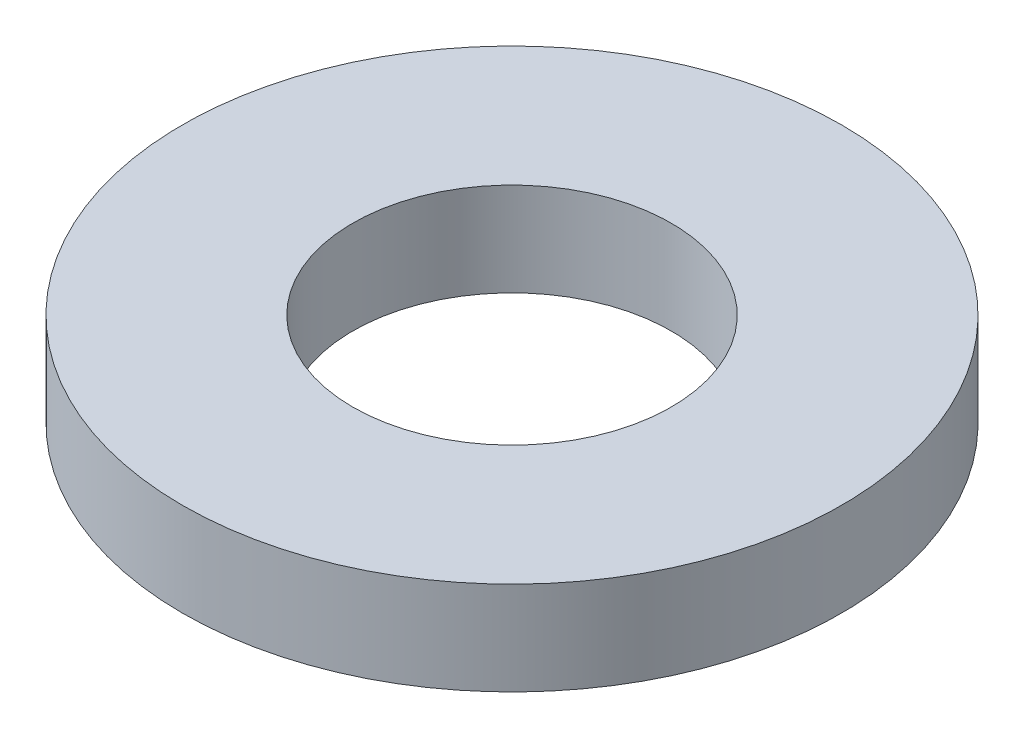
ISO-10303-21;
HEADER;
FILE_DESCRIPTION(('STEP AP214'),'2;1');
FILE_NAME('part.step','',(''),(''),'','','');
FILE_SCHEMA(('AUTOMOTIVE_DESIGN { 1 0 10303 214 1 1 1 1 }'));
ENDSEC;
DATA;
#1=APPLICATION_CONTEXT('core data for automotive mechanical design processes');
#2=APPLICATION_PROTOCOL_DEFINITION('international standard','automotive_design',2000,#1);
#3=PRODUCT_CONTEXT('',#1,'mechanical');
#4=PRODUCT('Part','Part','',(#3));
#5=PRODUCT_RELATED_PRODUCT_CATEGORY('part','',(#4));
#6=PRODUCT_DEFINITION_FORMATION('','',#4);
#7=PRODUCT_DEFINITION_CONTEXT('part definition',#1,'design');
#8=PRODUCT_DEFINITION('design','',#6,#7);
#9=PRODUCT_DEFINITION_SHAPE('','',#8);
#10=(LENGTH_UNIT() NAMED_UNIT(*) SI_UNIT(.MILLI.,.METRE.));
#11=(NAMED_UNIT(*) PLANE_ANGLE_UNIT() SI_UNIT($,.RADIAN.));
#12=(NAMED_UNIT(*) SI_UNIT($,.STERADIAN.) SOLID_ANGLE_UNIT());
#13=UNCERTAINTY_MEASURE_WITH_UNIT(LENGTH_MEASURE(1.E-05),#10,'distance_accuracy_value','');
#14=(GEOMETRIC_REPRESENTATION_CONTEXT(3) GLOBAL_UNCERTAINTY_ASSIGNED_CONTEXT((#13)) GLOBAL_UNIT_ASSIGNED_CONTEXT((#10,
#11,#12)) REPRESENTATION_CONTEXT('',''));
#15=CARTESIAN_POINT('',(0.,0.,0.));
#16=DIRECTION('',(0.,0.,1.));
#17=DIRECTION('',(1.,0.,0.));
#18=AXIS2_PLACEMENT_3D('',#15,#16,#17);
#19=CARTESIAN_POINT('',(0.,0.85,0.));
#20=DIRECTION('',(0.,1.,0.));
#21=DIRECTION('',(0.,0.,1.));
#22=AXIS2_PLACEMENT_3D('',#19,#20,#21);
#23=PLANE('',#22);
#24=CARTESIAN_POINT('',(0.,0.85,0.));
#25=DIRECTION('',(0.,1.,0.));
#26=DIRECTION('',(0.,0.,1.));
#27=AXIS2_PLACEMENT_3D('',#24,#25,#26);
#28=CIRCLE('',#27,3.);
#29=CARTESIAN_POINT('',(0.,0.85,3.));
#30=VERTEX_POINT('',#29);
#31=EDGE_CURVE('E10',#30,#30,#28,.T.);
#32=ORIENTED_EDGE('',*,*,#31,.T.);
#33=EDGE_LOOP('',(#32));
#34=FACE_BOUND('',#33,.T.);
#35=CARTESIAN_POINT('',(0.,0.85,0.));
#36=DIRECTION('',(0.,1.,0.));
#37=DIRECTION('',(0.,0.,1.));
#38=AXIS2_PLACEMENT_3D('',#35,#36,#37);
#39=CIRCLE('',#38,1.45);
#40=CARTESIAN_POINT('',(0.,0.85,1.45));
#41=VERTEX_POINT('',#40);
#42=EDGE_CURVE('E42',#41,#41,#39,.T.);
#43=ORIENTED_EDGE('',*,*,#42,.F.);
#44=EDGE_LOOP('',(#43));
#45=FACE_BOUND('',#44,.T.);
#46=ADVANCED_FACE('F31',(#34,#45),#23,.T.);
#47=CARTESIAN_POINT('',(0.,0.,0.));
#48=DIRECTION('',(0.,1.,0.));
#49=DIRECTION('',(0.,0.,1.));
#50=AXIS2_PLACEMENT_3D('',#47,#48,#49);
#51=PLANE('',#50);
#52=CARTESIAN_POINT('',(0.,0.,0.));
#53=DIRECTION('',(0.,1.,0.));
#54=DIRECTION('',(0.,0.,1.));
#55=AXIS2_PLACEMENT_3D('',#52,#53,#54);
#56=CIRCLE('',#55,3.);
#57=CARTESIAN_POINT('',(0.,0.,3.));
#58=VERTEX_POINT('',#57);
#59=EDGE_CURVE('E35',#58,#58,#56,.T.);
#60=ORIENTED_EDGE('',*,*,#59,.F.);
#61=EDGE_LOOP('',(#60));
#62=FACE_BOUND('',#61,.T.);
#63=CARTESIAN_POINT('',(0.,0.,0.));
#64=DIRECTION('',(0.,1.,0.));
#65=DIRECTION('',(0.,0.,1.));
#66=AXIS2_PLACEMENT_3D('',#63,#64,#65);
#67=CIRCLE('',#66,1.45);
#68=CARTESIAN_POINT('',(0.,0.,1.45));
#69=VERTEX_POINT('',#68);
#70=EDGE_CURVE('E44',#69,#69,#67,.T.);
#71=ORIENTED_EDGE('',*,*,#70,.T.);
#72=EDGE_LOOP('',(#71));
#73=FACE_BOUND('',#72,.T.);
#74=ADVANCED_FACE('F54',(#62,#73),#51,.F.);
#75=CARTESIAN_POINT('',(0.,0.85,0.));
#76=DIRECTION('',(0.,-1.,0.));
#77=DIRECTION('',(0.,0.,-1.));
#78=AXIS2_PLACEMENT_3D('',#75,#76,#77);
#79=CYLINDRICAL_SURFACE('',#78,3.);
#80=ORIENTED_EDGE('',*,*,#31,.F.);
#81=EDGE_LOOP('',(#80));
#82=FACE_BOUND('',#81,.T.);
#83=ORIENTED_EDGE('',*,*,#59,.T.);
#84=EDGE_LOOP('',(#83));
#85=FACE_BOUND('',#84,.T.);
#86=ADVANCED_FACE('F33',(#82,#85),#79,.T.);
#87=CARTESIAN_POINT('',(0.,0.85,0.));
#88=DIRECTION('',(0.,-1.,0.));
#89=DIRECTION('',(0.,0.,-1.));
#90=AXIS2_PLACEMENT_3D('',#87,#88,#89);
#91=CYLINDRICAL_SURFACE('',#90,1.45);
#92=ORIENTED_EDGE('',*,*,#42,.T.);
#93=EDGE_LOOP('',(#92));
#94=FACE_BOUND('',#93,.T.);
#95=ORIENTED_EDGE('',*,*,#70,.F.);
#96=EDGE_LOOP('',(#95));
#97=FACE_BOUND('',#96,.T.);
#98=ADVANCED_FACE('F50',(#94,#97),#91,.F.);
#99=CLOSED_SHELL('',(#46,#74,#86,#98));
#100=MANIFOLD_SOLID_BREP('B2',#99);
#101=ADVANCED_BREP_SHAPE_REPRESENTATION('',(#18,#100),#14);
#102=SHAPE_DEFINITION_REPRESENTATION(#9,#101);
ENDSEC;
END-ISO-10303-21;
